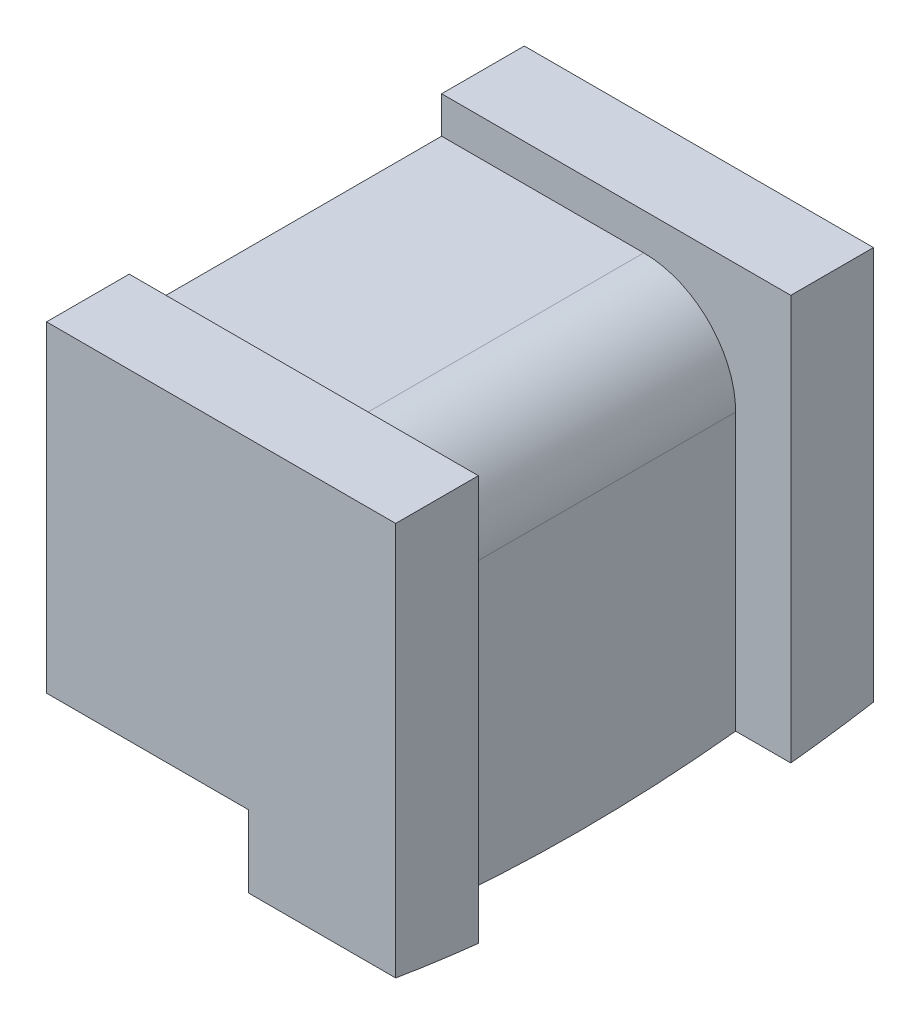
ISO-10303-21;
HEADER;
FILE_DESCRIPTION(('STEP AP214'),'2;1');
FILE_NAME('part.step','',(''),(''),'','','');
FILE_SCHEMA(('AUTOMOTIVE_DESIGN { 1 0 10303 214 1 1 1 1 }'));
ENDSEC;
DATA;
#1=APPLICATION_CONTEXT('core data for automotive mechanical design processes');
#2=APPLICATION_PROTOCOL_DEFINITION('international standard','automotive_design',2000,#1);
#3=PRODUCT_CONTEXT('',#1,'mechanical');
#4=PRODUCT('Part','Part','',(#3));
#5=PRODUCT_RELATED_PRODUCT_CATEGORY('part','',(#4));
#6=PRODUCT_DEFINITION_FORMATION('','',#4);
#7=PRODUCT_DEFINITION_CONTEXT('part definition',#1,'design');
#8=PRODUCT_DEFINITION('design','',#6,#7);
#9=PRODUCT_DEFINITION_SHAPE('','',#8);
#10=(LENGTH_UNIT() NAMED_UNIT(*) SI_UNIT(.MILLI.,.METRE.));
#11=(NAMED_UNIT(*) PLANE_ANGLE_UNIT() SI_UNIT($,.RADIAN.));
#12=(NAMED_UNIT(*) SI_UNIT($,.STERADIAN.) SOLID_ANGLE_UNIT());
#13=UNCERTAINTY_MEASURE_WITH_UNIT(LENGTH_MEASURE(1.E-05),#10,'distance_accuracy_value','');
#14=(GEOMETRIC_REPRESENTATION_CONTEXT(3) GLOBAL_UNCERTAINTY_ASSIGNED_CONTEXT((#13)) GLOBAL_UNIT_ASSIGNED_CONTEXT((#10,
#11,#12)) REPRESENTATION_CONTEXT('',''));
#15=CARTESIAN_POINT('',(0.,0.,0.));
#16=DIRECTION('',(0.,0.,1.));
#17=DIRECTION('',(1.,0.,0.));
#18=AXIS2_PLACEMENT_3D('',#15,#16,#17);
#19=CARTESIAN_POINT('',(45.6343373493976,-6.69066265060241,-0.85));
#20=DIRECTION('',(0.,0.,1.));
#21=DIRECTION('',(1.,0.,0.));
#22=AXIS2_PLACEMENT_3D('',#19,#20,#21);
#23=PLANE('',#22);
#24=CARTESIAN_POINT('',(45.7,-6.35,-0.85));
#25=DIRECTION('',(0.,0.,-1.));
#26=DIRECTION('',(-1.,0.,0.));
#27=AXIS2_PLACEMENT_3D('',#24,#25,#26);
#28=CIRCLE('',#27,0.500000000000001);
#29=CARTESIAN_POINT('',(45.7,-5.85,-0.85));
#30=VERTEX_POINT('',#29);
#31=CARTESIAN_POINT('',(46.2,-6.35,-0.85));
#32=VERTEX_POINT('',#31);
#33=EDGE_CURVE('E19',#30,#32,#28,.T.);
#34=ORIENTED_EDGE('',*,*,#33,.T.);
#35=DIRECTION('',(0.,1.,0.));
#36=VECTOR('',#35,1.);
#37=CARTESIAN_POINT('',(46.2,-6.35,-0.85));
#38=LINE('',#37,#36);
#39=CARTESIAN_POINT('',(46.2,-7.85413903620251,-0.85));
#40=VERTEX_POINT('',#39);
#41=EDGE_CURVE('E176',#40,#32,#38,.T.);
#42=ORIENTED_EDGE('',*,*,#41,.F.);
#43=DIRECTION('',(1.,0.,0.));
#44=VECTOR('',#43,1.);
#45=CARTESIAN_POINT('',(45.6343373493976,-7.85413903620251,-0.85));
#46=LINE('',#45,#44);
#47=CARTESIAN_POINT('',(46.5,-7.85413903620251,-0.85));
#48=VERTEX_POINT('',#47);
#49=EDGE_CURVE('E134',#40,#48,#46,.T.);
#50=ORIENTED_EDGE('',*,*,#49,.T.);
#51=DIRECTION('',(0.,1.,0.));
#52=VECTOR('',#51,1.);
#53=CARTESIAN_POINT('',(46.5,-5.65,-0.85));
#54=LINE('',#53,#52);
#55=CARTESIAN_POINT('',(46.5,-5.65,-0.85));
#56=VERTEX_POINT('',#55);
#57=EDGE_CURVE('E196',#56,#48,#54,.F.);
#58=ORIENTED_EDGE('',*,*,#57,.F.);
#59=DIRECTION('',(1.,0.,0.));
#60=VECTOR('',#59,1.);
#61=CARTESIAN_POINT('',(44.6,-5.65,-0.85));
#62=LINE('',#61,#60);
#63=CARTESIAN_POINT('',(44.6,-5.65,-0.85));
#64=VERTEX_POINT('',#63);
#65=EDGE_CURVE('E194',#64,#56,#62,.T.);
#66=ORIENTED_EDGE('',*,*,#65,.F.);
#67=DIRECTION('',(0.,1.,0.));
#68=VECTOR('',#67,1.);
#69=CARTESIAN_POINT('',(44.6,-6.69066265060241,-0.85));
#70=LINE('',#69,#68);
#71=CARTESIAN_POINT('',(44.6,-5.85,-0.85));
#72=VERTEX_POINT('',#71);
#73=EDGE_CURVE('E132',#64,#72,#70,.F.);
#74=ORIENTED_EDGE('',*,*,#73,.T.);
#75=DIRECTION('',(1.,0.,0.));
#76=VECTOR('',#75,1.);
#77=CARTESIAN_POINT('',(45.6343373493976,-5.85,-0.85));
#78=LINE('',#77,#76);
#79=EDGE_CURVE('E121',#72,#30,#78,.T.);
#80=ORIENTED_EDGE('',*,*,#79,.T.);
#81=EDGE_LOOP('',(#34,#42,#50,#58,#66,#74,#80));
#82=FACE_BOUND('',#81,.T.);
#83=ADVANCED_FACE('F16',(#82),#23,.T.);
#84=CARTESIAN_POINT('',(45.6343373493976,-6.69066265060241,0.85));
#85=DIRECTION('',(0.,0.,1.));
#86=DIRECTION('',(1.,0.,0.));
#87=AXIS2_PLACEMENT_3D('',#84,#85,#86);
#88=PLANE('',#87);
#89=DIRECTION('',(0.,1.,0.));
#90=VECTOR('',#89,1.);
#91=CARTESIAN_POINT('',(46.2,-6.35,0.85));
#92=LINE('',#91,#90);
#93=CARTESIAN_POINT('',(46.2,-6.35,0.85));
#94=VERTEX_POINT('',#93);
#95=CARTESIAN_POINT('',(46.2,-7.85413903620251,0.849999999999998));
#96=VERTEX_POINT('',#95);
#97=EDGE_CURVE('E178',#94,#96,#92,.F.);
#98=ORIENTED_EDGE('',*,*,#97,.F.);
#99=CARTESIAN_POINT('',(45.7,-6.35,0.85));
#100=DIRECTION('',(0.,0.,-1.));
#101=DIRECTION('',(-1.,0.,0.));
#102=AXIS2_PLACEMENT_3D('',#99,#100,#101);
#103=CIRCLE('',#102,0.500000000000001);
#104=CARTESIAN_POINT('',(45.7,-5.85,0.85));
#105=VERTEX_POINT('',#104);
#106=EDGE_CURVE('E175',#105,#94,#103,.T.);
#107=ORIENTED_EDGE('',*,*,#106,.F.);
#108=DIRECTION('',(1.,0.,0.));
#109=VECTOR('',#108,1.);
#110=CARTESIAN_POINT('',(45.6343373493976,-5.85,0.85));
#111=LINE('',#110,#109);
#112=CARTESIAN_POINT('',(44.6,-5.85,0.85));
#113=VERTEX_POINT('',#112);
#114=EDGE_CURVE('E126',#113,#105,#111,.T.);
#115=ORIENTED_EDGE('',*,*,#114,.F.);
#116=DIRECTION('',(0.,1.,0.));
#117=VECTOR('',#116,1.);
#118=CARTESIAN_POINT('',(44.6,-6.69066265060241,0.85));
#119=LINE('',#118,#117);
#120=CARTESIAN_POINT('',(44.6,-5.65,0.85));
#121=VERTEX_POINT('',#120);
#122=EDGE_CURVE('E120',#121,#113,#119,.F.);
#123=ORIENTED_EDGE('',*,*,#122,.F.);
#124=DIRECTION('',(1.,0.,0.));
#125=VECTOR('',#124,1.);
#126=CARTESIAN_POINT('',(44.6,-5.65,0.85));
#127=LINE('',#126,#125);
#128=CARTESIAN_POINT('',(46.5,-5.65,0.85));
#129=VERTEX_POINT('',#128);
#130=EDGE_CURVE('E160',#129,#121,#127,.F.);
#131=ORIENTED_EDGE('',*,*,#130,.F.);
#132=DIRECTION('',(0.,1.,0.));
#133=VECTOR('',#132,1.);
#134=CARTESIAN_POINT('',(46.5,-5.65,0.85));
#135=LINE('',#134,#133);
#136=CARTESIAN_POINT('',(46.5,-7.85413903620251,0.849999999999998));
#137=VERTEX_POINT('',#136);
#138=EDGE_CURVE('E166',#137,#129,#135,.T.);
#139=ORIENTED_EDGE('',*,*,#138,.F.);
#140=DIRECTION('',(-1.,0.,0.));
#141=VECTOR('',#140,1.);
#142=CARTESIAN_POINT('',(46.6,-7.85413903620251,0.849999999999995));
#143=LINE('',#142,#141);
#144=EDGE_CURVE('E169',#96,#137,#143,.F.);
#145=ORIENTED_EDGE('',*,*,#144,.F.);
#146=EDGE_LOOP('',(#98,#107,#115,#123,#131,#139,#145));
#147=FACE_BOUND('',#146,.T.);
#148=ADVANCED_FACE('F285',(#147),#88,.F.);
#149=CARTESIAN_POINT('',(46.2,-6.35,-1.3));
#150=DIRECTION('',(1.,0.,0.));
#151=DIRECTION('',(0.,0.,-1.));
#152=AXIS2_PLACEMENT_3D('',#149,#150,#151);
#153=PLANE('',#152);
#154=DIRECTION('',(0.,0.,-1.));
#155=VECTOR('',#154,1.);
#156=CARTESIAN_POINT('',(46.2,-6.35,-1.3));
#157=LINE('',#156,#155);
#158=EDGE_CURVE('E115',#94,#32,#157,.T.);
#159=ORIENTED_EDGE('',*,*,#158,.F.);
#160=ORIENTED_EDGE('',*,*,#97,.T.);
#161=CARTESIAN_POINT('',(46.2,0.,0.));
#162=DIRECTION('',(-1.,0.,0.));
#163=DIRECTION('',(0.,0.,1.));
#164=AXIS2_PLACEMENT_3D('',#161,#162,#163);
#165=CIRCLE('',#164,7.9);
#166=EDGE_CURVE('E170',#40,#96,#165,.T.);
#167=ORIENTED_EDGE('',*,*,#166,.F.);
#168=ORIENTED_EDGE('',*,*,#41,.T.);
#169=EDGE_LOOP('',(#159,#160,#167,#168));
#170=FACE_BOUND('',#169,.T.);
#171=ADVANCED_FACE('F317',(#170),#153,.T.);
#172=CARTESIAN_POINT('',(46.5,-5.65,-1.3));
#173=DIRECTION('',(1.,0.,0.));
#174=DIRECTION('',(0.,0.,-1.));
#175=AXIS2_PLACEMENT_3D('',#172,#173,#174);
#176=PLANE('',#175);
#177=DIRECTION('',(0.,0.,1.));
#178=VECTOR('',#177,1.);
#179=CARTESIAN_POINT('',(46.5,-5.65,-1.3));
#180=LINE('',#179,#178);
#181=CARTESIAN_POINT('',(46.5,-5.65,-1.3));
#182=VERTEX_POINT('',#181);
#183=EDGE_CURVE('E148',#56,#182,#180,.F.);
#184=ORIENTED_EDGE('',*,*,#183,.F.);
#185=ORIENTED_EDGE('',*,*,#57,.T.);
#186=CARTESIAN_POINT('',(46.5,0.,0.));
#187=DIRECTION('',(-1.,0.,0.));
#188=DIRECTION('',(0.,0.,1.));
#189=AXIS2_PLACEMENT_3D('',#186,#187,#188);
#190=CIRCLE('',#189,7.9);
#191=CARTESIAN_POINT('',(46.5,-7.79230389551126,-1.3));
#192=VERTEX_POINT('',#191);
#193=EDGE_CURVE('E147',#192,#48,#190,.T.);
#194=ORIENTED_EDGE('',*,*,#193,.F.);
#195=DIRECTION('',(0.,1.,0.));
#196=VECTOR('',#195,1.);
#197=CARTESIAN_POINT('',(46.5,-6.69066265060241,-1.3));
#198=LINE('',#197,#196);
#199=EDGE_CURVE('E152',#192,#182,#198,.T.);
#200=ORIENTED_EDGE('',*,*,#199,.T.);
#201=EDGE_LOOP('',(#184,#185,#194,#200));
#202=FACE_BOUND('',#201,.T.);
#203=ADVANCED_FACE('F318',(#202),#176,.T.);
#204=CARTESIAN_POINT('',(44.6,-5.65,-1.3));
#205=DIRECTION('',(0.,1.,0.));
#206=DIRECTION('',(0.,0.,1.));
#207=AXIS2_PLACEMENT_3D('',#204,#205,#206);
#208=PLANE('',#207);
#209=DIRECTION('',(1.,0.,0.));
#210=VECTOR('',#209,1.);
#211=CARTESIAN_POINT('',(45.6343373493976,-5.65,-1.3));
#212=LINE('',#211,#210);
#213=CARTESIAN_POINT('',(44.6,-5.65,-1.3));
#214=VERTEX_POINT('',#213);
#215=EDGE_CURVE('E211',#182,#214,#212,.F.);
#216=ORIENTED_EDGE('',*,*,#215,.T.);
#217=DIRECTION('',(0.,0.,1.));
#218=VECTOR('',#217,1.);
#219=CARTESIAN_POINT('',(44.6,-5.65,-1.3));
#220=LINE('',#219,#218);
#221=EDGE_CURVE('E144',#214,#64,#220,.T.);
#222=ORIENTED_EDGE('',*,*,#221,.T.);
#223=ORIENTED_EDGE('',*,*,#65,.T.);
#224=ORIENTED_EDGE('',*,*,#183,.T.);
#225=EDGE_LOOP('',(#216,#222,#223,#224));
#226=FACE_BOUND('',#225,.T.);
#227=ADVANCED_FACE('F319',(#226),#208,.T.);
#228=CARTESIAN_POINT('',(45.7,-7.9,-1.3));
#229=DIRECTION('',(-1.,0.,0.));
#230=DIRECTION('',(0.,0.,1.));
#231=AXIS2_PLACEMENT_3D('',#228,#229,#230);
#232=PLANE('',#231);
#233=DIRECTION('',(0.,0.,-1.));
#234=VECTOR('',#233,1.);
#235=CARTESIAN_POINT('',(45.7,-7.4,-1.3));
#236=LINE('',#235,#234);
#237=CARTESIAN_POINT('',(45.7,-7.4,-1.3));
#238=VERTEX_POINT('',#237);
#239=CARTESIAN_POINT('',(45.7,-7.4,1.3));
#240=VERTEX_POINT('',#239);
#241=EDGE_CURVE('E230',#238,#240,#236,.F.);
#242=ORIENTED_EDGE('',*,*,#241,.F.);
#243=DIRECTION('',(0.,1.,0.));
#244=VECTOR('',#243,1.);
#245=CARTESIAN_POINT('',(45.7,-6.69066265060241,-1.3));
#246=LINE('',#245,#244);
#247=CARTESIAN_POINT('',(45.7,-7.79230389551126,-1.3));
#248=VERTEX_POINT('',#247);
#249=EDGE_CURVE('E218',#238,#248,#246,.F.);
#250=ORIENTED_EDGE('',*,*,#249,.T.);
#251=CARTESIAN_POINT('',(45.7,0.,0.));
#252=DIRECTION('',(-1.,0.,0.));
#253=DIRECTION('',(0.,0.,1.));
#254=AXIS2_PLACEMENT_3D('',#251,#252,#253);
#255=CIRCLE('',#254,7.9);
#256=CARTESIAN_POINT('',(45.7,-7.79230389551126,1.3));
#257=VERTEX_POINT('',#256);
#258=EDGE_CURVE('E167',#257,#248,#255,.F.);
#259=ORIENTED_EDGE('',*,*,#258,.F.);
#260=DIRECTION('',(0.,1.,0.));
#261=VECTOR('',#260,1.);
#262=CARTESIAN_POINT('',(45.7,-7.9,1.3));
#263=LINE('',#262,#261);
#264=EDGE_CURVE('E173',#257,#240,#263,.T.);
#265=ORIENTED_EDGE('',*,*,#264,.T.);
#266=EDGE_LOOP('',(#242,#250,#259,#265));
#267=FACE_BOUND('',#266,.T.);
#268=ADVANCED_FACE('F265',(#267),#232,.T.);
#269=CARTESIAN_POINT('',(46.6,0.,0.));
#270=DIRECTION('',(-1.,0.,0.));
#271=DIRECTION('',(0.,0.,1.));
#272=AXIS2_PLACEMENT_3D('',#269,#270,#271);
#273=CYLINDRICAL_SURFACE('',#272,7.9);
#274=DIRECTION('',(1.,0.,0.));
#275=VECTOR('',#274,1.);
#276=CARTESIAN_POINT('',(45.6343373493976,-7.79230389551126,1.3));
#277=LINE('',#276,#275);
#278=CARTESIAN_POINT('',(46.5,-7.79230389551126,1.3));
#279=VERTEX_POINT('',#278);
#280=EDGE_CURVE('E243',#257,#279,#277,.T.);
#281=ORIENTED_EDGE('',*,*,#280,.F.);
#282=ORIENTED_EDGE('',*,*,#258,.T.);
#283=DIRECTION('',(1.,0.,0.));
#284=VECTOR('',#283,1.);
#285=CARTESIAN_POINT('',(45.6343373493976,-7.79230389551126,-1.3));
#286=LINE('',#285,#284);
#287=EDGE_CURVE('E223',#248,#192,#286,.T.);
#288=ORIENTED_EDGE('',*,*,#287,.T.);
#289=ORIENTED_EDGE('',*,*,#193,.T.);
#290=ORIENTED_EDGE('',*,*,#49,.F.);
#291=ORIENTED_EDGE('',*,*,#166,.T.);
#292=ORIENTED_EDGE('',*,*,#144,.T.);
#293=CARTESIAN_POINT('',(46.5,0.,0.));
#294=DIRECTION('',(-1.,0.,0.));
#295=DIRECTION('',(0.,0.,1.));
#296=AXIS2_PLACEMENT_3D('',#293,#294,#295);
#297=CIRCLE('',#296,7.9);
#298=EDGE_CURVE('E163',#279,#137,#297,.F.);
#299=ORIENTED_EDGE('',*,*,#298,.F.);
#300=EDGE_LOOP('',(#281,#282,#288,#289,#290,#291,#292,#299));
#301=FACE_BOUND('',#300,.T.);
#302=ADVANCED_FACE('F296',(#301),#273,.T.);
#303=CARTESIAN_POINT('',(46.5,-5.65,0.85));
#304=DIRECTION('',(1.,0.,0.));
#305=DIRECTION('',(0.,0.,-1.));
#306=AXIS2_PLACEMENT_3D('',#303,#304,#305);
#307=PLANE('',#306);
#308=DIRECTION('',(0.,0.,1.));
#309=VECTOR('',#308,1.);
#310=CARTESIAN_POINT('',(46.5,-5.65,0.85));
#311=LINE('',#310,#309);
#312=CARTESIAN_POINT('',(46.5,-5.65,1.3));
#313=VERTEX_POINT('',#312);
#314=EDGE_CURVE('E186',#313,#129,#311,.F.);
#315=ORIENTED_EDGE('',*,*,#314,.F.);
#316=DIRECTION('',(0.,1.,0.));
#317=VECTOR('',#316,1.);
#318=CARTESIAN_POINT('',(46.5,-6.69066265060241,1.3));
#319=LINE('',#318,#317);
#320=EDGE_CURVE('E247',#279,#313,#319,.T.);
#321=ORIENTED_EDGE('',*,*,#320,.F.);
#322=ORIENTED_EDGE('',*,*,#298,.T.);
#323=ORIENTED_EDGE('',*,*,#138,.T.);
#324=EDGE_LOOP('',(#315,#321,#322,#323));
#325=FACE_BOUND('',#324,.T.);
#326=ADVANCED_FACE('F281',(#325),#307,.T.);
#327=CARTESIAN_POINT('',(44.6,-5.65,0.85));
#328=DIRECTION('',(0.,1.,0.));
#329=DIRECTION('',(0.,0.,1.));
#330=AXIS2_PLACEMENT_3D('',#327,#328,#329);
#331=PLANE('',#330);
#332=ORIENTED_EDGE('',*,*,#130,.T.);
#333=DIRECTION('',(0.,0.,1.));
#334=VECTOR('',#333,1.);
#335=CARTESIAN_POINT('',(44.6,-5.65,0.85));
#336=LINE('',#335,#334);
#337=CARTESIAN_POINT('',(44.6,-5.65,1.3));
#338=VERTEX_POINT('',#337);
#339=EDGE_CURVE('E34',#121,#338,#336,.T.);
#340=ORIENTED_EDGE('',*,*,#339,.T.);
#341=DIRECTION('',(1.,0.,0.));
#342=VECTOR('',#341,1.);
#343=CARTESIAN_POINT('',(45.6343373493976,-5.65,1.3));
#344=LINE('',#343,#342);
#345=EDGE_CURVE('E192',#313,#338,#344,.F.);
#346=ORIENTED_EDGE('',*,*,#345,.F.);
#347=ORIENTED_EDGE('',*,*,#314,.T.);
#348=EDGE_LOOP('',(#332,#340,#346,#347));
#349=FACE_BOUND('',#348,.T.);
#350=ADVANCED_FACE('F286',(#349),#331,.T.);
#351=CARTESIAN_POINT('',(45.7,-6.35,-1.3));
#352=DIRECTION('',(0.,0.,-1.));
#353=DIRECTION('',(-1.,0.,0.));
#354=AXIS2_PLACEMENT_3D('',#351,#352,#353);
#355=CYLINDRICAL_SURFACE('',#354,0.500000000000001);
#356=ORIENTED_EDGE('',*,*,#106,.T.);
#357=ORIENTED_EDGE('',*,*,#158,.T.);
#358=ORIENTED_EDGE('',*,*,#33,.F.);
#359=DIRECTION('',(0.,0.,1.));
#360=VECTOR('',#359,1.);
#361=CARTESIAN_POINT('',(45.7,-5.85,-1.3));
#362=LINE('',#361,#360);
#363=EDGE_CURVE('E112',#105,#30,#362,.F.);
#364=ORIENTED_EDGE('',*,*,#363,.F.);
#365=EDGE_LOOP('',(#356,#357,#358,#364));
#366=FACE_BOUND('',#365,.T.);
#367=ADVANCED_FACE('F111',(#366),#355,.T.);
#368=CARTESIAN_POINT('',(45.6343373493976,-6.69066265060241,-1.3));
#369=DIRECTION('',(0.,0.,1.));
#370=DIRECTION('',(1.,0.,0.));
#371=AXIS2_PLACEMENT_3D('',#368,#369,#370);
#372=PLANE('',#371);
#373=ORIENTED_EDGE('',*,*,#249,.F.);
#374=DIRECTION('',(1.,0.,0.));
#375=VECTOR('',#374,1.);
#376=CARTESIAN_POINT('',(46.,-7.4,-1.3));
#377=LINE('',#376,#375);
#378=CARTESIAN_POINT('',(44.6,-7.4,-1.3));
#379=VERTEX_POINT('',#378);
#380=EDGE_CURVE('E240',#379,#238,#377,.T.);
#381=ORIENTED_EDGE('',*,*,#380,.F.);
#382=DIRECTION('',(0.,1.,0.));
#383=VECTOR('',#382,1.);
#384=CARTESIAN_POINT('',(44.6,-7.4,-1.3));
#385=LINE('',#384,#383);
#386=EDGE_CURVE('E127',#214,#379,#385,.F.);
#387=ORIENTED_EDGE('',*,*,#386,.F.);
#388=ORIENTED_EDGE('',*,*,#215,.F.);
#389=ORIENTED_EDGE('',*,*,#199,.F.);
#390=ORIENTED_EDGE('',*,*,#287,.F.);
#391=EDGE_LOOP('',(#373,#381,#387,#388,#389,#390));
#392=FACE_BOUND('',#391,.T.);
#393=ADVANCED_FACE('F294',(#392),#372,.F.);
#394=CARTESIAN_POINT('',(46.,-7.4,-1.3));
#395=DIRECTION('',(0.,-1.,0.));
#396=DIRECTION('',(0.,0.,-1.));
#397=AXIS2_PLACEMENT_3D('',#394,#395,#396);
#398=PLANE('',#397);
#399=DIRECTION('',(0.,0.,1.));
#400=VECTOR('',#399,1.);
#401=CARTESIAN_POINT('',(44.6,-7.4,-1.3));
#402=LINE('',#401,#400);
#403=CARTESIAN_POINT('',(44.6,-7.4,1.3));
#404=VERTEX_POINT('',#403);
#405=EDGE_CURVE('E272',#379,#404,#402,.T.);
#406=ORIENTED_EDGE('',*,*,#405,.F.);
#407=ORIENTED_EDGE('',*,*,#380,.T.);
#408=ORIENTED_EDGE('',*,*,#241,.T.);
#409=DIRECTION('',(1.,0.,0.));
#410=VECTOR('',#409,1.);
#411=CARTESIAN_POINT('',(45.6343373493976,-7.4,1.3));
#412=LINE('',#411,#410);
#413=EDGE_CURVE('E128',#404,#240,#412,.T.);
#414=ORIENTED_EDGE('',*,*,#413,.F.);
#415=EDGE_LOOP('',(#406,#407,#408,#414));
#416=FACE_BOUND('',#415,.T.);
#417=ADVANCED_FACE('F266',(#416),#398,.T.);
#418=CARTESIAN_POINT('',(45.6343373493976,-6.69066265060241,1.3));
#419=DIRECTION('',(0.,0.,1.));
#420=DIRECTION('',(1.,0.,0.));
#421=AXIS2_PLACEMENT_3D('',#418,#419,#420);
#422=PLANE('',#421);
#423=ORIENTED_EDGE('',*,*,#413,.T.);
#424=ORIENTED_EDGE('',*,*,#264,.F.);
#425=ORIENTED_EDGE('',*,*,#280,.T.);
#426=ORIENTED_EDGE('',*,*,#320,.T.);
#427=ORIENTED_EDGE('',*,*,#345,.T.);
#428=DIRECTION('',(0.,1.,0.));
#429=VECTOR('',#428,1.);
#430=CARTESIAN_POINT('',(44.6,-7.4,1.3));
#431=LINE('',#430,#429);
#432=EDGE_CURVE('E25',#404,#338,#431,.T.);
#433=ORIENTED_EDGE('',*,*,#432,.F.);
#434=EDGE_LOOP('',(#423,#424,#425,#426,#427,#433));
#435=FACE_BOUND('',#434,.T.);
#436=ADVANCED_FACE('F268',(#435),#422,.T.);
#437=CARTESIAN_POINT('',(44.6,-5.85,-1.3));
#438=DIRECTION('',(0.,1.,0.));
#439=DIRECTION('',(0.,0.,1.));
#440=AXIS2_PLACEMENT_3D('',#437,#438,#439);
#441=PLANE('',#440);
#442=ORIENTED_EDGE('',*,*,#114,.T.);
#443=ORIENTED_EDGE('',*,*,#363,.T.);
#444=ORIENTED_EDGE('',*,*,#79,.F.);
#445=DIRECTION('',(0.,0.,1.));
#446=VECTOR('',#445,1.);
#447=CARTESIAN_POINT('',(44.6,-5.85,-1.3));
#448=LINE('',#447,#446);
#449=EDGE_CURVE('E11',#113,#72,#448,.F.);
#450=ORIENTED_EDGE('',*,*,#449,.F.);
#451=EDGE_LOOP('',(#442,#443,#444,#450));
#452=FACE_BOUND('',#451,.T.);
#453=ADVANCED_FACE('F123',(#452),#441,.T.);
#454=CARTESIAN_POINT('',(44.6,-7.4,-1.3));
#455=DIRECTION('',(-1.,0.,0.));
#456=DIRECTION('',(0.,0.,1.));
#457=AXIS2_PLACEMENT_3D('',#454,#455,#456);
#458=PLANE('',#457);
#459=ORIENTED_EDGE('',*,*,#122,.T.);
#460=ORIENTED_EDGE('',*,*,#449,.T.);
#461=ORIENTED_EDGE('',*,*,#73,.F.);
#462=ORIENTED_EDGE('',*,*,#221,.F.);
#463=ORIENTED_EDGE('',*,*,#386,.T.);
#464=ORIENTED_EDGE('',*,*,#405,.T.);
#465=ORIENTED_EDGE('',*,*,#432,.T.);
#466=ORIENTED_EDGE('',*,*,#339,.F.);
#467=EDGE_LOOP('',(#459,#460,#461,#462,#463,#464,#465,#466));
#468=FACE_BOUND('',#467,.T.);
#469=ADVANCED_FACE('F275',(#468),#458,.T.);
#470=CLOSED_SHELL('',(#83,#148,#171,#203,#227,#268,#302,#326,#350,#367,#393,#417,#436,#453,#469));
#471=MANIFOLD_SOLID_BREP('B1',#470);
#472=ADVANCED_BREP_SHAPE_REPRESENTATION('',(#18,#471),#14);
#473=SHAPE_DEFINITION_REPRESENTATION(#9,#472);
ENDSEC;
END-ISO-10303-21;
